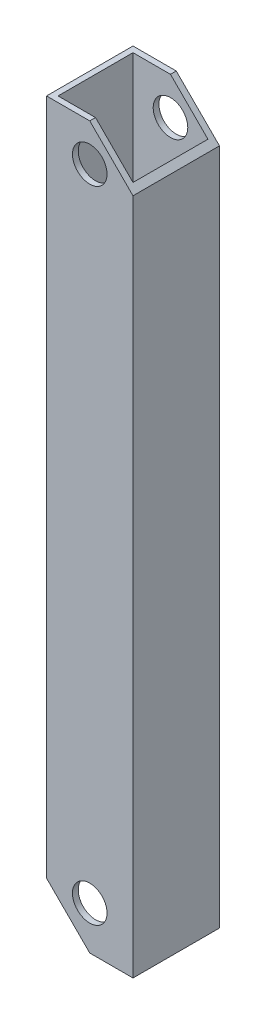
ISO-10303-21;
HEADER;
FILE_DESCRIPTION(('STEP AP214'),'2;1');
FILE_NAME('part.step','',(''),(''),'','','');
FILE_SCHEMA(('AUTOMOTIVE_DESIGN { 1 0 10303 214 1 1 1 1 }'));
ENDSEC;
DATA;
#1=APPLICATION_CONTEXT('core data for automotive mechanical design processes');
#2=APPLICATION_PROTOCOL_DEFINITION('international standard','automotive_design',2000,#1);
#3=PRODUCT_CONTEXT('',#1,'mechanical');
#4=PRODUCT('Part','Part','',(#3));
#5=PRODUCT_RELATED_PRODUCT_CATEGORY('part','',(#4));
#6=PRODUCT_DEFINITION_FORMATION('','',#4);
#7=PRODUCT_DEFINITION_CONTEXT('part definition',#1,'design');
#8=PRODUCT_DEFINITION('design','',#6,#7);
#9=PRODUCT_DEFINITION_SHAPE('','',#8);
#10=(LENGTH_UNIT() NAMED_UNIT(*) SI_UNIT(.MILLI.,.METRE.));
#11=(NAMED_UNIT(*) PLANE_ANGLE_UNIT() SI_UNIT($,.RADIAN.));
#12=(NAMED_UNIT(*) SI_UNIT($,.STERADIAN.) SOLID_ANGLE_UNIT());
#13=UNCERTAINTY_MEASURE_WITH_UNIT(LENGTH_MEASURE(1.E-05),#10,'distance_accuracy_value','');
#14=(GEOMETRIC_REPRESENTATION_CONTEXT(3) GLOBAL_UNCERTAINTY_ASSIGNED_CONTEXT((#13)) GLOBAL_UNIT_ASSIGNED_CONTEXT((#10,
#11,#12)) REPRESENTATION_CONTEXT('',''));
#15=CARTESIAN_POINT('',(0.,0.,0.));
#16=DIRECTION('',(0.,0.,1.));
#17=DIRECTION('',(1.,0.,0.));
#18=AXIS2_PLACEMENT_3D('',#15,#16,#17);
#19=CARTESIAN_POINT('',(0.,250.,0.));
#20=DIRECTION('',(1.,0.,0.));
#21=DIRECTION('',(0.,0.,-1.));
#22=AXIS2_PLACEMENT_3D('',#19,#20,#21);
#23=PLANE('',#22);
#24=DIRECTION('',(0.,-1.,0.));
#25=VECTOR('',#24,1.);
#26=CARTESIAN_POINT('',(0.,250.,-30.));
#27=LINE('',#26,#25);
#28=CARTESIAN_POINT('',(0.,250.,-30.));
#29=VERTEX_POINT('',#28);
#30=CARTESIAN_POINT('',(0.,15.,-30.));
#31=VERTEX_POINT('',#30);
#32=EDGE_CURVE('E170',#29,#31,#27,.T.);
#33=ORIENTED_EDGE('',*,*,#32,.T.);
#34=DIRECTION('',(0.,0.,1.));
#35=VECTOR('',#34,1.);
#36=CARTESIAN_POINT('',(0.,15.,-30.));
#37=LINE('',#36,#35);
#38=CARTESIAN_POINT('',(0.,15.,0.));
#39=VERTEX_POINT('',#38);
#40=EDGE_CURVE('E132',#31,#39,#37,.T.);
#41=ORIENTED_EDGE('',*,*,#40,.T.);
#42=DIRECTION('',(0.,-1.,0.));
#43=VECTOR('',#42,1.);
#44=CARTESIAN_POINT('',(0.,250.,0.));
#45=LINE('',#44,#43);
#46=CARTESIAN_POINT('',(0.,250.,0.));
#47=VERTEX_POINT('',#46);
#48=EDGE_CURVE('E180',#47,#39,#45,.T.);
#49=ORIENTED_EDGE('',*,*,#48,.F.);
#50=DIRECTION('',(0.,0.,1.));
#51=VECTOR('',#50,1.);
#52=CARTESIAN_POINT('',(0.,250.,0.));
#53=LINE('',#52,#51);
#54=EDGE_CURVE('E158',#29,#47,#53,.T.);
#55=ORIENTED_EDGE('',*,*,#54,.F.);
#56=EDGE_LOOP('',(#33,#41,#49,#55));
#57=FACE_BOUND('',#56,.T.);
#58=ADVANCED_FACE('F40',(#57),#23,.F.);
#59=CARTESIAN_POINT('',(0.,250.,0.));
#60=DIRECTION('',(0.,0.,-1.));
#61=DIRECTION('',(-1.,0.,0.));
#62=AXIS2_PLACEMENT_3D('',#59,#60,#61);
#63=PLANE('',#62);
#64=CARTESIAN_POINT('',(15.,237.,0.));
#65=DIRECTION('',(0.,0.,1.));
#66=DIRECTION('',(1.,0.,0.));
#67=AXIS2_PLACEMENT_3D('',#64,#65,#66);
#68=CIRCLE('',#67,6.);
#69=CARTESIAN_POINT('',(21.,237.,0.));
#70=VERTEX_POINT('',#69);
#71=EDGE_CURVE('E265',#70,#70,#68,.T.);
#72=ORIENTED_EDGE('',*,*,#71,.F.);
#73=EDGE_LOOP('',(#72));
#74=FACE_BOUND('',#73,.T.);
#75=CARTESIAN_POINT('',(15.,15.,0.));
#76=DIRECTION('',(0.,0.,1.));
#77=DIRECTION('',(1.,0.,0.));
#78=AXIS2_PLACEMENT_3D('',#75,#76,#77);
#79=CIRCLE('',#78,6.);
#80=CARTESIAN_POINT('',(21.,15.,0.));
#81=VERTEX_POINT('',#80);
#82=EDGE_CURVE('E255',#81,#81,#79,.T.);
#83=ORIENTED_EDGE('',*,*,#82,.F.);
#84=EDGE_LOOP('',(#83));
#85=FACE_BOUND('',#84,.T.);
#86=ORIENTED_EDGE('',*,*,#48,.T.);
#87=DIRECTION('',(-0.707106781186547,0.707106781186547,0.));
#88=VECTOR('',#87,1.);
#89=CARTESIAN_POINT('',(15.,0.,0.));
#90=LINE('',#89,#88);
#91=CARTESIAN_POINT('',(15.,0.,0.));
#92=VERTEX_POINT('',#91);
#93=EDGE_CURVE('E139',#92,#39,#90,.T.);
#94=ORIENTED_EDGE('',*,*,#93,.F.);
#95=DIRECTION('',(1.,0.,0.));
#96=VECTOR('',#95,1.);
#97=CARTESIAN_POINT('',(0.,0.,0.));
#98=LINE('',#97,#96);
#99=CARTESIAN_POINT('',(30.,0.,0.));
#100=VERTEX_POINT('',#99);
#101=EDGE_CURVE('E166',#92,#100,#98,.T.);
#102=ORIENTED_EDGE('',*,*,#101,.T.);
#103=DIRECTION('',(0.,-1.,0.));
#104=VECTOR('',#103,1.);
#105=CARTESIAN_POINT('',(30.,250.,0.));
#106=LINE('',#105,#104);
#107=CARTESIAN_POINT('',(30.,235.,0.));
#108=VERTEX_POINT('',#107);
#109=EDGE_CURVE('E176',#108,#100,#106,.T.);
#110=ORIENTED_EDGE('',*,*,#109,.F.);
#111=DIRECTION('',(0.707106781186547,-0.707106781186548,0.));
#112=VECTOR('',#111,1.);
#113=CARTESIAN_POINT('',(15.,250.,0.));
#114=LINE('',#113,#112);
#115=CARTESIAN_POINT('',(15.,250.,0.));
#116=VERTEX_POINT('',#115);
#117=EDGE_CURVE('E286',#116,#108,#114,.T.);
#118=ORIENTED_EDGE('',*,*,#117,.F.);
#119=DIRECTION('',(1.,0.,0.));
#120=VECTOR('',#119,1.);
#121=CARTESIAN_POINT('',(0.,250.,0.));
#122=LINE('',#121,#120);
#123=EDGE_CURVE('E164',#47,#116,#122,.T.);
#124=ORIENTED_EDGE('',*,*,#123,.F.);
#125=EDGE_LOOP('',(#86,#94,#102,#110,#118,#124));
#126=FACE_BOUND('',#125,.T.);
#127=ADVANCED_FACE('F304',(#74,#85,#126),#63,.F.);
#128=CARTESIAN_POINT('',(30.,250.,0.));
#129=DIRECTION('',(-1.,0.,0.));
#130=DIRECTION('',(0.,0.,1.));
#131=AXIS2_PLACEMENT_3D('',#128,#129,#130);
#132=PLANE('',#131);
#133=DIRECTION('',(0.,-1.,0.));
#134=VECTOR('',#133,1.);
#135=CARTESIAN_POINT('',(30.,250.,-30.));
#136=LINE('',#135,#134);
#137=CARTESIAN_POINT('',(30.,235.,-30.));
#138=VERTEX_POINT('',#137);
#139=CARTESIAN_POINT('',(30.,0.,-30.));
#140=VERTEX_POINT('',#139);
#141=EDGE_CURVE('E155',#138,#140,#136,.T.);
#142=ORIENTED_EDGE('',*,*,#141,.F.);
#143=DIRECTION('',(0.,0.,1.));
#144=VECTOR('',#143,1.);
#145=CARTESIAN_POINT('',(30.,235.,-30.));
#146=LINE('',#145,#144);
#147=EDGE_CURVE('E278',#138,#108,#146,.T.);
#148=ORIENTED_EDGE('',*,*,#147,.T.);
#149=ORIENTED_EDGE('',*,*,#109,.T.);
#150=DIRECTION('',(0.,0.,-1.));
#151=VECTOR('',#150,1.);
#152=CARTESIAN_POINT('',(30.,0.,0.));
#153=LINE('',#152,#151);
#154=EDGE_CURVE('E159',#100,#140,#153,.T.);
#155=ORIENTED_EDGE('',*,*,#154,.T.);
#156=EDGE_LOOP('',(#142,#148,#149,#155));
#157=FACE_BOUND('',#156,.T.);
#158=ADVANCED_FACE('F312',(#157),#132,.F.);
#159=CARTESIAN_POINT('',(0.,250.,-30.));
#160=DIRECTION('',(0.,0.,1.));
#161=DIRECTION('',(1.,0.,0.));
#162=AXIS2_PLACEMENT_3D('',#159,#160,#161);
#163=PLANE('',#162);
#164=CARTESIAN_POINT('',(15.,237.,-30.));
#165=DIRECTION('',(0.,0.,1.));
#166=DIRECTION('',(1.,0.,0.));
#167=AXIS2_PLACEMENT_3D('',#164,#165,#166);
#168=CIRCLE('',#167,6.);
#169=CARTESIAN_POINT('',(21.,237.,-30.));
#170=VERTEX_POINT('',#169);
#171=EDGE_CURVE('E194',#170,#170,#168,.T.);
#172=ORIENTED_EDGE('',*,*,#171,.T.);
#173=EDGE_LOOP('',(#172));
#174=FACE_BOUND('',#173,.T.);
#175=CARTESIAN_POINT('',(15.,15.,-30.));
#176=DIRECTION('',(0.,0.,1.));
#177=DIRECTION('',(1.,0.,0.));
#178=AXIS2_PLACEMENT_3D('',#175,#176,#177);
#179=CIRCLE('',#178,6.);
#180=CARTESIAN_POINT('',(21.,15.,-30.));
#181=VERTEX_POINT('',#180);
#182=EDGE_CURVE('E189',#181,#181,#179,.T.);
#183=ORIENTED_EDGE('',*,*,#182,.T.);
#184=EDGE_LOOP('',(#183));
#185=FACE_BOUND('',#184,.T.);
#186=DIRECTION('',(-1.,0.,0.));
#187=VECTOR('',#186,1.);
#188=CARTESIAN_POINT('',(0.,0.,-30.));
#189=LINE('',#188,#187);
#190=CARTESIAN_POINT('',(15.,0.,-30.));
#191=VERTEX_POINT('',#190);
#192=EDGE_CURVE('E146',#140,#191,#189,.T.);
#193=ORIENTED_EDGE('',*,*,#192,.T.);
#194=DIRECTION('',(-0.707106781186547,0.707106781186547,0.));
#195=VECTOR('',#194,1.);
#196=CARTESIAN_POINT('',(15.,0.,-30.));
#197=LINE('',#196,#195);
#198=EDGE_CURVE('E126',#191,#31,#197,.T.);
#199=ORIENTED_EDGE('',*,*,#198,.T.);
#200=ORIENTED_EDGE('',*,*,#32,.F.);
#201=DIRECTION('',(-1.,0.,0.));
#202=VECTOR('',#201,1.);
#203=CARTESIAN_POINT('',(0.,250.,-30.));
#204=LINE('',#203,#202);
#205=CARTESIAN_POINT('',(15.,250.,-30.));
#206=VERTEX_POINT('',#205);
#207=EDGE_CURVE('E173',#206,#29,#204,.T.);
#208=ORIENTED_EDGE('',*,*,#207,.F.);
#209=DIRECTION('',(0.707106781186547,-0.707106781186548,0.));
#210=VECTOR('',#209,1.);
#211=CARTESIAN_POINT('',(15.,250.,-30.));
#212=LINE('',#211,#210);
#213=EDGE_CURVE('E289',#206,#138,#212,.T.);
#214=ORIENTED_EDGE('',*,*,#213,.T.);
#215=ORIENTED_EDGE('',*,*,#141,.T.);
#216=EDGE_LOOP('',(#193,#199,#200,#208,#214,#215));
#217=FACE_BOUND('',#216,.T.);
#218=ADVANCED_FACE('F152',(#174,#185,#217),#163,.F.);
#219=CARTESIAN_POINT('',(0.,250.,0.));
#220=DIRECTION('',(0.,-1.,0.));
#221=DIRECTION('',(0.,0.,-1.));
#222=AXIS2_PLACEMENT_3D('',#219,#220,#221);
#223=PLANE('',#222);
#224=ORIENTED_EDGE('',*,*,#123,.T.);
#225=DIRECTION('',(0.,0.,1.));
#226=VECTOR('',#225,1.);
#227=CARTESIAN_POINT('',(15.,250.,-30.));
#228=LINE('',#227,#226);
#229=CARTESIAN_POINT('',(15.,250.,-2.));
#230=VERTEX_POINT('',#229);
#231=EDGE_CURVE('E282',#230,#116,#228,.T.);
#232=ORIENTED_EDGE('',*,*,#231,.F.);
#233=DIRECTION('',(1.,0.,0.));
#234=VECTOR('',#233,1.);
#235=CARTESIAN_POINT('',(2.,250.,-2.));
#236=LINE('',#235,#234);
#237=CARTESIAN_POINT('',(2.,250.,-2.));
#238=VERTEX_POINT('',#237);
#239=EDGE_CURVE('E204',#238,#230,#236,.T.);
#240=ORIENTED_EDGE('',*,*,#239,.F.);
#241=DIRECTION('',(0.,0.,1.));
#242=VECTOR('',#241,1.);
#243=CARTESIAN_POINT('',(2.,250.,-2.));
#244=LINE('',#243,#242);
#245=CARTESIAN_POINT('',(2.,250.,-28.));
#246=VERTEX_POINT('',#245);
#247=EDGE_CURVE('E243',#246,#238,#244,.T.);
#248=ORIENTED_EDGE('',*,*,#247,.F.);
#249=DIRECTION('',(-1.,0.,0.));
#250=VECTOR('',#249,1.);
#251=CARTESIAN_POINT('',(2.,250.,-28.));
#252=LINE('',#251,#250);
#253=CARTESIAN_POINT('',(15.,250.,-28.));
#254=VERTEX_POINT('',#253);
#255=EDGE_CURVE('E237',#254,#246,#252,.T.);
#256=ORIENTED_EDGE('',*,*,#255,.F.);
#257=EDGE_CURVE('E279',#206,#254,#228,.T.);
#258=ORIENTED_EDGE('',*,*,#257,.F.);
#259=ORIENTED_EDGE('',*,*,#207,.T.);
#260=ORIENTED_EDGE('',*,*,#54,.T.);
#261=EDGE_LOOP('',(#224,#232,#240,#248,#256,#258,#259,#260));
#262=FACE_BOUND('',#261,.T.);
#263=ADVANCED_FACE('F307',(#262),#223,.F.);
#264=CARTESIAN_POINT('',(0.,0.,0.));
#265=DIRECTION('',(0.,-1.,0.));
#266=DIRECTION('',(0.,0.,-1.));
#267=AXIS2_PLACEMENT_3D('',#264,#265,#266);
#268=PLANE('',#267);
#269=DIRECTION('',(0.,0.,1.));
#270=VECTOR('',#269,1.);
#271=CARTESIAN_POINT('',(15.,0.,-30.));
#272=LINE('',#271,#270);
#273=CARTESIAN_POINT('',(15.,0.,-28.));
#274=VERTEX_POINT('',#273);
#275=EDGE_CURVE('E129',#191,#274,#272,.T.);
#276=ORIENTED_EDGE('',*,*,#275,.F.);
#277=ORIENTED_EDGE('',*,*,#192,.F.);
#278=ORIENTED_EDGE('',*,*,#154,.F.);
#279=ORIENTED_EDGE('',*,*,#101,.F.);
#280=CARTESIAN_POINT('',(15.,0.,-2.));
#281=VERTEX_POINT('',#280);
#282=EDGE_CURVE('E138',#281,#92,#272,.T.);
#283=ORIENTED_EDGE('',*,*,#282,.F.);
#284=DIRECTION('',(1.,0.,0.));
#285=VECTOR('',#284,1.);
#286=CARTESIAN_POINT('',(2.,0.,-2.));
#287=LINE('',#286,#285);
#288=CARTESIAN_POINT('',(28.,0.,-2.));
#289=VERTEX_POINT('',#288);
#290=EDGE_CURVE('E240',#281,#289,#287,.T.);
#291=ORIENTED_EDGE('',*,*,#290,.T.);
#292=DIRECTION('',(0.,0.,-1.));
#293=VECTOR('',#292,1.);
#294=CARTESIAN_POINT('',(28.,0.,-2.));
#295=LINE('',#294,#293);
#296=CARTESIAN_POINT('',(28.,0.,-28.));
#297=VERTEX_POINT('',#296);
#298=EDGE_CURVE('E210',#289,#297,#295,.T.);
#299=ORIENTED_EDGE('',*,*,#298,.T.);
#300=DIRECTION('',(-1.,0.,0.));
#301=VECTOR('',#300,1.);
#302=CARTESIAN_POINT('',(2.,0.,-28.));
#303=LINE('',#302,#301);
#304=EDGE_CURVE('E149',#297,#274,#303,.T.);
#305=ORIENTED_EDGE('',*,*,#304,.T.);
#306=EDGE_LOOP('',(#276,#277,#278,#279,#283,#291,#299,#305));
#307=FACE_BOUND('',#306,.T.);
#308=ADVANCED_FACE('F144',(#307),#268,.T.);
#309=CARTESIAN_POINT('',(2.,0.,-2.));
#310=DIRECTION('',(-1.,0.,0.));
#311=DIRECTION('',(0.,0.,1.));
#312=AXIS2_PLACEMENT_3D('',#309,#310,#311);
#313=PLANE('',#312);
#314=DIRECTION('',(0.,1.,0.));
#315=VECTOR('',#314,1.);
#316=CARTESIAN_POINT('',(2.,0.,-2.));
#317=LINE('',#316,#315);
#318=CARTESIAN_POINT('',(2.,13.,-2.));
#319=VERTEX_POINT('',#318);
#320=EDGE_CURVE('E213',#319,#238,#317,.T.);
#321=ORIENTED_EDGE('',*,*,#320,.F.);
#322=DIRECTION('',(0.,0.,-1.));
#323=VECTOR('',#322,1.);
#324=CARTESIAN_POINT('',(2.,13.,-2.));
#325=LINE('',#324,#323);
#326=CARTESIAN_POINT('',(2.,13.,-28.));
#327=VERTEX_POINT('',#326);
#328=EDGE_CURVE('E55',#319,#327,#325,.T.);
#329=ORIENTED_EDGE('',*,*,#328,.T.);
#330=DIRECTION('',(0.,1.,0.));
#331=VECTOR('',#330,1.);
#332=CARTESIAN_POINT('',(2.,0.,-28.));
#333=LINE('',#332,#331);
#334=EDGE_CURVE('E217',#327,#246,#333,.T.);
#335=ORIENTED_EDGE('',*,*,#334,.T.);
#336=ORIENTED_EDGE('',*,*,#247,.T.);
#337=EDGE_LOOP('',(#321,#329,#335,#336));
#338=FACE_BOUND('',#337,.T.);
#339=ADVANCED_FACE('F315',(#338),#313,.F.);
#340=CARTESIAN_POINT('',(2.,0.,-28.));
#341=DIRECTION('',(0.,0.,-1.));
#342=DIRECTION('',(-1.,0.,0.));
#343=AXIS2_PLACEMENT_3D('',#340,#341,#342);
#344=PLANE('',#343);
#345=CARTESIAN_POINT('',(15.,237.,-28.));
#346=DIRECTION('',(0.,0.,-1.));
#347=DIRECTION('',(-1.,0.,0.));
#348=AXIS2_PLACEMENT_3D('',#345,#346,#347);
#349=CIRCLE('',#348,6.);
#350=CARTESIAN_POINT('',(9.,237.,-28.));
#351=VERTEX_POINT('',#350);
#352=EDGE_CURVE('E193',#351,#351,#349,.T.);
#353=ORIENTED_EDGE('',*,*,#352,.T.);
#354=EDGE_LOOP('',(#353));
#355=FACE_BOUND('',#354,.T.);
#356=CARTESIAN_POINT('',(15.,15.,-28.));
#357=DIRECTION('',(0.,0.,-1.));
#358=DIRECTION('',(-1.,0.,0.));
#359=AXIS2_PLACEMENT_3D('',#356,#357,#358);
#360=CIRCLE('',#359,6.);
#361=CARTESIAN_POINT('',(9.,15.,-28.));
#362=VERTEX_POINT('',#361);
#363=EDGE_CURVE('E188',#362,#362,#360,.T.);
#364=ORIENTED_EDGE('',*,*,#363,.T.);
#365=EDGE_LOOP('',(#364));
#366=FACE_BOUND('',#365,.T.);
#367=ORIENTED_EDGE('',*,*,#334,.F.);
#368=DIRECTION('',(0.707106781186548,-0.707106781186548,0.));
#369=VECTOR('',#368,1.);
#370=CARTESIAN_POINT('',(8.5,6.5,-28.));
#371=LINE('',#370,#369);
#372=EDGE_CURVE('E290',#327,#274,#371,.T.);
#373=ORIENTED_EDGE('',*,*,#372,.T.);
#374=ORIENTED_EDGE('',*,*,#304,.F.);
#375=DIRECTION('',(0.,1.,0.));
#376=VECTOR('',#375,1.);
#377=CARTESIAN_POINT('',(28.,0.,-28.));
#378=LINE('',#377,#376);
#379=CARTESIAN_POINT('',(28.,237.,-28.));
#380=VERTEX_POINT('',#379);
#381=EDGE_CURVE('E212',#297,#380,#378,.T.);
#382=ORIENTED_EDGE('',*,*,#381,.T.);
#383=DIRECTION('',(-0.707106781186547,0.707106781186548,0.));
#384=VECTOR('',#383,1.);
#385=CARTESIAN_POINT('',(133.5,131.5,-28.));
#386=LINE('',#385,#384);
#387=EDGE_CURVE('E269',#380,#254,#386,.T.);
#388=ORIENTED_EDGE('',*,*,#387,.T.);
#389=ORIENTED_EDGE('',*,*,#255,.T.);
#390=EDGE_LOOP('',(#367,#373,#374,#382,#388,#389));
#391=FACE_BOUND('',#390,.T.);
#392=ADVANCED_FACE('F351',(#355,#366,#391),#344,.F.);
#393=CARTESIAN_POINT('',(28.,0.,-2.));
#394=DIRECTION('',(1.,0.,0.));
#395=DIRECTION('',(0.,0.,-1.));
#396=AXIS2_PLACEMENT_3D('',#393,#394,#395);
#397=PLANE('',#396);
#398=DIRECTION('',(0.,1.,0.));
#399=VECTOR('',#398,1.);
#400=CARTESIAN_POINT('',(28.,0.,-2.));
#401=LINE('',#400,#399);
#402=CARTESIAN_POINT('',(28.,237.,-2.));
#403=VERTEX_POINT('',#402);
#404=EDGE_CURVE('E202',#289,#403,#401,.T.);
#405=ORIENTED_EDGE('',*,*,#404,.T.);
#406=DIRECTION('',(0.,0.,-1.));
#407=VECTOR('',#406,1.);
#408=CARTESIAN_POINT('',(28.,237.,-2.));
#409=LINE('',#408,#407);
#410=EDGE_CURVE('E62',#403,#380,#409,.T.);
#411=ORIENTED_EDGE('',*,*,#410,.T.);
#412=ORIENTED_EDGE('',*,*,#381,.F.);
#413=ORIENTED_EDGE('',*,*,#298,.F.);
#414=EDGE_LOOP('',(#405,#411,#412,#413));
#415=FACE_BOUND('',#414,.T.);
#416=ADVANCED_FACE('F208',(#415),#397,.F.);
#417=CARTESIAN_POINT('',(2.,0.,-2.));
#418=DIRECTION('',(0.,0.,1.));
#419=DIRECTION('',(1.,0.,0.));
#420=AXIS2_PLACEMENT_3D('',#417,#418,#419);
#421=PLANE('',#420);
#422=CARTESIAN_POINT('',(15.,237.,-2.));
#423=DIRECTION('',(0.,0.,1.));
#424=DIRECTION('',(1.,0.,0.));
#425=AXIS2_PLACEMENT_3D('',#422,#423,#424);
#426=CIRCLE('',#425,6.);
#427=CARTESIAN_POINT('',(21.,237.,-2.));
#428=VERTEX_POINT('',#427);
#429=EDGE_CURVE('E190',#428,#428,#426,.T.);
#430=ORIENTED_EDGE('',*,*,#429,.T.);
#431=EDGE_LOOP('',(#430));
#432=FACE_BOUND('',#431,.T.);
#433=CARTESIAN_POINT('',(15.,15.,-2.));
#434=DIRECTION('',(0.,0.,1.));
#435=DIRECTION('',(1.,0.,0.));
#436=AXIS2_PLACEMENT_3D('',#433,#434,#435);
#437=CIRCLE('',#436,6.);
#438=CARTESIAN_POINT('',(21.,15.,-2.));
#439=VERTEX_POINT('',#438);
#440=EDGE_CURVE('E184',#439,#439,#437,.T.);
#441=ORIENTED_EDGE('',*,*,#440,.T.);
#442=EDGE_LOOP('',(#441));
#443=FACE_BOUND('',#442,.T.);
#444=ORIENTED_EDGE('',*,*,#290,.F.);
#445=DIRECTION('',(-0.707106781186548,0.707106781186548,0.));
#446=VECTOR('',#445,1.);
#447=CARTESIAN_POINT('',(8.5,6.5,-2.));
#448=LINE('',#447,#446);
#449=EDGE_CURVE('E11',#281,#319,#448,.T.);
#450=ORIENTED_EDGE('',*,*,#449,.T.);
#451=ORIENTED_EDGE('',*,*,#320,.T.);
#452=ORIENTED_EDGE('',*,*,#239,.T.);
#453=DIRECTION('',(0.707106781186547,-0.707106781186548,0.));
#454=VECTOR('',#453,1.);
#455=CARTESIAN_POINT('',(133.5,131.5,-2.));
#456=LINE('',#455,#454);
#457=EDGE_CURVE('E48',#230,#403,#456,.T.);
#458=ORIENTED_EDGE('',*,*,#457,.T.);
#459=ORIENTED_EDGE('',*,*,#404,.F.);
#460=EDGE_LOOP('',(#444,#450,#451,#452,#458,#459));
#461=FACE_BOUND('',#460,.T.);
#462=ADVANCED_FACE('F201',(#432,#443,#461),#421,.F.);
#463=CARTESIAN_POINT('',(15.,15.,-30.));
#464=DIRECTION('',(0.,0.,1.));
#465=DIRECTION('',(1.,0.,0.));
#466=AXIS2_PLACEMENT_3D('',#463,#464,#465);
#467=CYLINDRICAL_SURFACE('',#466,6.);
#468=ORIENTED_EDGE('',*,*,#82,.T.);
#469=EDGE_LOOP('',(#468));
#470=FACE_BOUND('',#469,.T.);
#471=ORIENTED_EDGE('',*,*,#440,.F.);
#472=EDGE_LOOP('',(#471));
#473=FACE_BOUND('',#472,.T.);
#474=ADVANCED_FACE('F354',(#470,#473),#467,.F.);
#475=ORIENTED_EDGE('',*,*,#182,.F.);
#476=EDGE_LOOP('',(#475));
#477=FACE_BOUND('',#476,.T.);
#478=ORIENTED_EDGE('',*,*,#363,.F.);
#479=EDGE_LOOP('',(#478));
#480=FACE_BOUND('',#479,.T.);
#481=ADVANCED_FACE('F361',(#477,#480),#467,.F.);
#482=CARTESIAN_POINT('',(15.,237.,-30.));
#483=DIRECTION('',(0.,0.,1.));
#484=DIRECTION('',(1.,0.,0.));
#485=AXIS2_PLACEMENT_3D('',#482,#483,#484);
#486=CYLINDRICAL_SURFACE('',#485,6.);
#487=ORIENTED_EDGE('',*,*,#71,.T.);
#488=EDGE_LOOP('',(#487));
#489=FACE_BOUND('',#488,.T.);
#490=ORIENTED_EDGE('',*,*,#429,.F.);
#491=EDGE_LOOP('',(#490));
#492=FACE_BOUND('',#491,.T.);
#493=ADVANCED_FACE('F327',(#489,#492),#486,.F.);
#494=ORIENTED_EDGE('',*,*,#171,.F.);
#495=EDGE_LOOP('',(#494));
#496=FACE_BOUND('',#495,.T.);
#497=ORIENTED_EDGE('',*,*,#352,.F.);
#498=EDGE_LOOP('',(#497));
#499=FACE_BOUND('',#498,.T.);
#500=ADVANCED_FACE('F320',(#496,#499),#486,.F.);
#501=CARTESIAN_POINT('',(15.,250.,-30.));
#502=DIRECTION('',(-0.707106781186548,-0.707106781186547,0.));
#503=DIRECTION('',(0.707106781186547,-0.707106781186548,0.));
#504=AXIS2_PLACEMENT_3D('',#501,#502,#503);
#505=PLANE('',#504);
#506=ORIENTED_EDGE('',*,*,#410,.F.);
#507=ORIENTED_EDGE('',*,*,#457,.F.);
#508=ORIENTED_EDGE('',*,*,#231,.T.);
#509=ORIENTED_EDGE('',*,*,#117,.T.);
#510=ORIENTED_EDGE('',*,*,#147,.F.);
#511=ORIENTED_EDGE('',*,*,#213,.F.);
#512=ORIENTED_EDGE('',*,*,#257,.T.);
#513=ORIENTED_EDGE('',*,*,#387,.F.);
#514=EDGE_LOOP('',(#506,#507,#508,#509,#510,#511,#512,#513));
#515=FACE_BOUND('',#514,.T.);
#516=ADVANCED_FACE('F318',(#515),#505,.F.);
#517=CARTESIAN_POINT('',(15.,0.,-30.));
#518=DIRECTION('',(0.707106781186547,0.707106781186547,0.));
#519=DIRECTION('',(-0.707106781186548,0.707106781186548,0.));
#520=AXIS2_PLACEMENT_3D('',#517,#518,#519);
#521=PLANE('',#520);
#522=ORIENTED_EDGE('',*,*,#328,.F.);
#523=ORIENTED_EDGE('',*,*,#449,.F.);
#524=ORIENTED_EDGE('',*,*,#282,.T.);
#525=ORIENTED_EDGE('',*,*,#93,.T.);
#526=ORIENTED_EDGE('',*,*,#40,.F.);
#527=ORIENTED_EDGE('',*,*,#198,.F.);
#528=ORIENTED_EDGE('',*,*,#275,.T.);
#529=ORIENTED_EDGE('',*,*,#372,.F.);
#530=EDGE_LOOP('',(#522,#523,#524,#525,#526,#527,#528,#529));
#531=FACE_BOUND('',#530,.T.);
#532=ADVANCED_FACE('F128',(#531),#521,.F.);
#533=CLOSED_SHELL('',(#58,#127,#158,#218,#263,#308,#339,#392,#416,#462,#474,#481,#493,#500,#516,#532));
#534=MANIFOLD_SOLID_BREP('B2',#533);
#535=ADVANCED_BREP_SHAPE_REPRESENTATION('',(#18,#534),#14);
#536=SHAPE_DEFINITION_REPRESENTATION(#9,#535);
ENDSEC;
END-ISO-10303-21;
